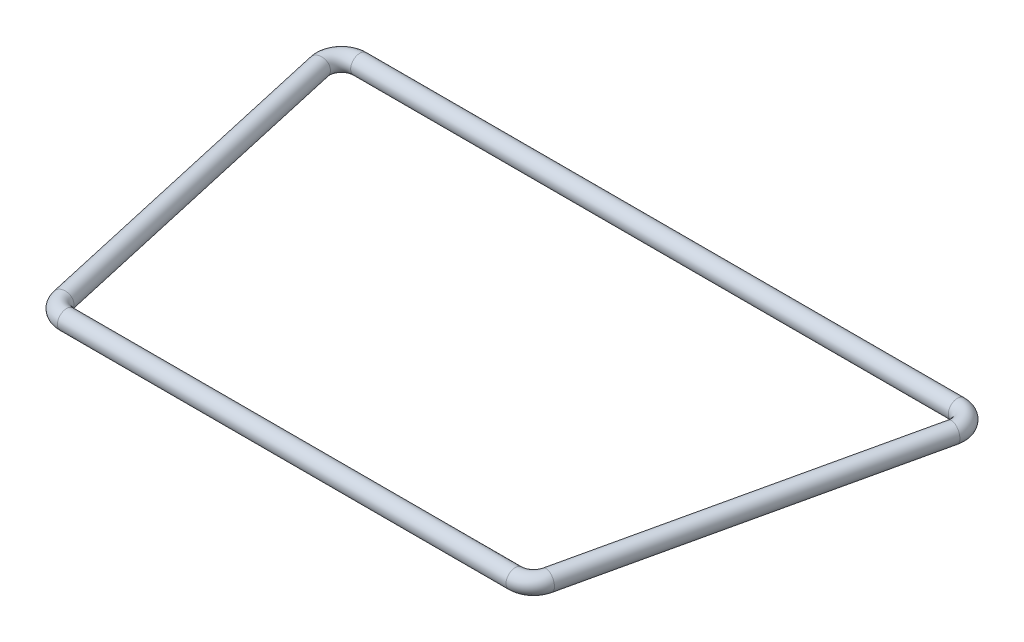
ISO-10303-21;
HEADER;
FILE_DESCRIPTION(('STEP AP214'),'2;1');
FILE_NAME('part.step','',(''),(''),'','','');
FILE_SCHEMA(('AUTOMOTIVE_DESIGN { 1 0 10303 214 1 1 1 1 }'));
ENDSEC;
DATA;
#1=APPLICATION_CONTEXT('core data for automotive mechanical design processes');
#2=APPLICATION_PROTOCOL_DEFINITION('international standard','automotive_design',2000,#1);
#3=PRODUCT_CONTEXT('',#1,'mechanical');
#4=PRODUCT('Part','Part','',(#3));
#5=PRODUCT_RELATED_PRODUCT_CATEGORY('part','',(#4));
#6=PRODUCT_DEFINITION_FORMATION('','',#4);
#7=PRODUCT_DEFINITION_CONTEXT('part definition',#1,'design');
#8=PRODUCT_DEFINITION('design','',#6,#7);
#9=PRODUCT_DEFINITION_SHAPE('','',#8);
#10=(LENGTH_UNIT() NAMED_UNIT(*) SI_UNIT(.MILLI.,.METRE.));
#11=(NAMED_UNIT(*) PLANE_ANGLE_UNIT() SI_UNIT($,.RADIAN.));
#12=(NAMED_UNIT(*) SI_UNIT($,.STERADIAN.) SOLID_ANGLE_UNIT());
#13=UNCERTAINTY_MEASURE_WITH_UNIT(LENGTH_MEASURE(1.E-05),#10,'distance_accuracy_value','');
#14=(GEOMETRIC_REPRESENTATION_CONTEXT(3) GLOBAL_UNCERTAINTY_ASSIGNED_CONTEXT((#13)) GLOBAL_UNIT_ASSIGNED_CONTEXT((#10,
#11,#12)) REPRESENTATION_CONTEXT('',''));
#15=CARTESIAN_POINT('',(0.,0.,0.));
#16=DIRECTION('',(0.,0.,1.));
#17=DIRECTION('',(1.,0.,0.));
#18=AXIS2_PLACEMENT_3D('',#15,#16,#17);
#19=CARTESIAN_POINT('',(30.988,0.,-2.53999999999999));
#20=DIRECTION('',(0.,1.,0.));
#21=DIRECTION('',(0.,0.,1.));
#22=AXIS2_PLACEMENT_3D('',#19,#20,#21);
#23=TOROIDAL_SURFACE('',#22,2.54,1.27);
#24=CARTESIAN_POINT('',(30.988,0.,0.));
#25=DIRECTION('',(1.,0.,0.));
#26=DIRECTION('',(0.,0.,-1.));
#27=AXIS2_PLACEMENT_3D('',#24,#25,#26);
#28=CIRCLE('',#27,1.27);
#29=CARTESIAN_POINT('',(30.988,0.,1.27000000000001));
#30=VERTEX_POINT('',#29);
#31=EDGE_CURVE('E11',#30,#30,#28,.T.);
#32=CARTESIAN_POINT('',(33.4660487804878,0.,-1.98243902439024));
#33=DIRECTION('',(0.21951219512195,0.,-0.975609756097561));
#34=DIRECTION('',(-0.975609756097561,0.,-0.21951219512195));
#35=AXIS2_PLACEMENT_3D('',#32,#33,#34);
#36=CIRCLE('',#35,1.27);
#37=CARTESIAN_POINT('',(34.7050731707317,0.,-1.70365853658536));
#38=VERTEX_POINT('',#37);
#39=EDGE_CURVE('E72',#38,#38,#36,.T.);
#40=CARTESIAN_POINT('',(30.988,0.,-2.53999999999999));
#41=DIRECTION('',(0.,1.,0.));
#42=DIRECTION('',(0.,0.,1.));
#43=AXIS2_PLACEMENT_3D('',#40,#41,#42);
#44=CIRCLE('',#43,3.81);
#45=EDGE_CURVE('',#30,#38,#44,.T.);
#46=ORIENTED_EDGE('',*,*,#31,.T.);
#47=ORIENTED_EDGE('',*,*,#39,.F.);
#48=ORIENTED_EDGE('',*,*,#45,.T.);
#49=ORIENTED_EDGE('',*,*,#45,.F.);
#50=EDGE_LOOP('',(#46,#48,#47,#49));
#51=FACE_BOUND('',#50,.T.);
#52=ADVANCED_FACE('F44',(#51),#23,.T.);
#53=CARTESIAN_POINT('',(-30.988,0.,0.));
#54=DIRECTION('',(1.,0.,0.));
#55=DIRECTION('',(0.,0.,-1.));
#56=AXIS2_PLACEMENT_3D('',#53,#54,#55);
#57=CYLINDRICAL_SURFACE('',#56,1.27);
#58=ORIENTED_EDGE('',*,*,#31,.F.);
#59=EDGE_LOOP('',(#58));
#60=FACE_BOUND('',#59,.T.);
#61=CARTESIAN_POINT('',(-30.988,0.,0.));
#62=DIRECTION('',(1.,0.,0.));
#63=DIRECTION('',(0.,0.,-1.));
#64=AXIS2_PLACEMENT_3D('',#61,#62,#63);
#65=CIRCLE('',#64,1.27);
#66=CARTESIAN_POINT('',(-30.988,0.,1.27));
#67=VERTEX_POINT('',#66);
#68=EDGE_CURVE('E50',#67,#67,#65,.T.);
#69=ORIENTED_EDGE('',*,*,#68,.T.);
#70=EDGE_LOOP('',(#69));
#71=FACE_BOUND('',#70,.T.);
#72=ADVANCED_FACE('F79',(#60,#71),#57,.T.);
#73=CARTESIAN_POINT('',(-30.988,0.,-2.53999999999999));
#74=DIRECTION('',(0.,1.,0.));
#75=DIRECTION('',(0.,0.,1.));
#76=AXIS2_PLACEMENT_3D('',#73,#74,#75);
#77=TOROIDAL_SURFACE('',#76,2.53999999999999,1.27);
#78=CARTESIAN_POINT('',(-33.4660487804878,0.,-1.98243902439024));
#79=DIRECTION('',(0.219512195121953,0.,0.975609756097561));
#80=DIRECTION('',(0.975609756097561,0.,-0.219512195121953));
#81=AXIS2_PLACEMENT_3D('',#78,#79,#80);
#82=CIRCLE('',#81,1.27);
#83=CARTESIAN_POINT('',(-34.7050731707317,0.,-1.70365853658535));
#84=VERTEX_POINT('',#83);
#85=EDGE_CURVE('E54',#84,#84,#82,.T.);
#86=CARTESIAN_POINT('',(-30.988,0.,-2.53999999999999));
#87=DIRECTION('',(0.,1.,0.));
#88=DIRECTION('',(0.,0.,1.));
#89=AXIS2_PLACEMENT_3D('',#86,#87,#88);
#90=CIRCLE('',#89,3.81);
#91=EDGE_CURVE('',#84,#67,#90,.T.);
#92=ORIENTED_EDGE('',*,*,#85,.T.);
#93=ORIENTED_EDGE('',*,*,#68,.F.);
#94=ORIENTED_EDGE('',*,*,#91,.T.);
#95=ORIENTED_EDGE('',*,*,#91,.F.);
#96=EDGE_LOOP('',(#92,#94,#93,#95));
#97=FACE_BOUND('',#96,.T.);
#98=ADVANCED_FACE('F83',(#97),#77,.T.);
#99=CARTESIAN_POINT('',(-43.7530487804878,0.,-47.7024390243902));
#100=DIRECTION('',(0.219512195121951,0.,0.975609756097561));
#101=DIRECTION('',(0.975609756097561,0.,-0.219512195121951));
#102=AXIS2_PLACEMENT_3D('',#99,#100,#101);
#103=CYLINDRICAL_SURFACE('',#102,1.27);
#104=ORIENTED_EDGE('',*,*,#85,.F.);
#105=EDGE_LOOP('',(#104));
#106=FACE_BOUND('',#105,.T.);
#107=CARTESIAN_POINT('',(-43.7530487804878,0.,-47.7024390243902));
#108=DIRECTION('',(0.219512195121953,0.,0.975609756097561));
#109=DIRECTION('',(0.975609756097561,0.,-0.219512195121953));
#110=AXIS2_PLACEMENT_3D('',#107,#108,#109);
#111=CIRCLE('',#110,1.27);
#112=CARTESIAN_POINT('',(-44.9920731707317,0.,-47.4236585365853));
#113=VERTEX_POINT('',#112);
#114=EDGE_CURVE('E58',#113,#113,#111,.T.);
#115=ORIENTED_EDGE('',*,*,#114,.T.);
#116=EDGE_LOOP('',(#115));
#117=FACE_BOUND('',#116,.T.);
#118=ADVANCED_FACE('F88',(#106,#117),#103,.T.);
#119=CARTESIAN_POINT('',(-41.275,0.,-48.26));
#120=DIRECTION('',(0.,1.,0.));
#121=DIRECTION('',(0.,0.,1.));
#122=AXIS2_PLACEMENT_3D('',#119,#120,#121);
#123=TOROIDAL_SURFACE('',#122,2.54,1.27);
#124=CARTESIAN_POINT('',(-41.275,0.,-50.8));
#125=DIRECTION('',(-1.,0.,0.));
#126=DIRECTION('',(0.,0.,1.));
#127=AXIS2_PLACEMENT_3D('',#124,#125,#126);
#128=CIRCLE('',#127,1.27);
#129=CARTESIAN_POINT('',(-41.275,0.,-52.07));
#130=VERTEX_POINT('',#129);
#131=EDGE_CURVE('E63',#130,#130,#128,.T.);
#132=CARTESIAN_POINT('',(-41.275,0.,-48.26));
#133=DIRECTION('',(0.,1.,0.));
#134=DIRECTION('',(0.,0.,1.));
#135=AXIS2_PLACEMENT_3D('',#132,#133,#134);
#136=CIRCLE('',#135,3.81);
#137=EDGE_CURVE('',#130,#113,#136,.T.);
#138=ORIENTED_EDGE('',*,*,#131,.T.);
#139=ORIENTED_EDGE('',*,*,#114,.F.);
#140=ORIENTED_EDGE('',*,*,#137,.T.);
#141=ORIENTED_EDGE('',*,*,#137,.F.);
#142=EDGE_LOOP('',(#138,#140,#139,#141));
#143=FACE_BOUND('',#142,.T.);
#144=ADVANCED_FACE('F94',(#143),#123,.T.);
#145=CARTESIAN_POINT('',(41.275,0.,-50.8));
#146=DIRECTION('',(-1.,0.,0.));
#147=DIRECTION('',(0.,0.,1.));
#148=AXIS2_PLACEMENT_3D('',#145,#146,#147);
#149=CYLINDRICAL_SURFACE('',#148,1.27);
#150=ORIENTED_EDGE('',*,*,#131,.F.);
#151=EDGE_LOOP('',(#150));
#152=FACE_BOUND('',#151,.T.);
#153=CARTESIAN_POINT('',(41.275,0.,-50.8));
#154=DIRECTION('',(-1.,0.,0.));
#155=DIRECTION('',(0.,0.,1.));
#156=AXIS2_PLACEMENT_3D('',#153,#154,#155);
#157=CIRCLE('',#156,1.27);
#158=CARTESIAN_POINT('',(41.275,0.,-52.07));
#159=VERTEX_POINT('',#158);
#160=EDGE_CURVE('E66',#159,#159,#157,.T.);
#161=ORIENTED_EDGE('',*,*,#160,.T.);
#162=EDGE_LOOP('',(#161));
#163=FACE_BOUND('',#162,.T.);
#164=ADVANCED_FACE('F98',(#152,#163),#149,.T.);
#165=CARTESIAN_POINT('',(41.275,0.,-48.26));
#166=DIRECTION('',(0.,1.,0.));
#167=DIRECTION('',(0.,0.,1.));
#168=AXIS2_PLACEMENT_3D('',#165,#166,#167);
#169=TOROIDAL_SURFACE('',#168,2.54,1.27);
#170=CARTESIAN_POINT('',(43.7530487804878,0.,-47.7024390243902));
#171=DIRECTION('',(0.21951219512195,0.,-0.975609756097561));
#172=DIRECTION('',(-0.975609756097561,0.,-0.21951219512195));
#173=AXIS2_PLACEMENT_3D('',#170,#171,#172);
#174=CIRCLE('',#173,1.27);
#175=CARTESIAN_POINT('',(44.9920731707317,0.,-47.4236585365853));
#176=VERTEX_POINT('',#175);
#177=EDGE_CURVE('E69',#176,#176,#174,.T.);
#178=CARTESIAN_POINT('',(41.275,0.,-48.26));
#179=DIRECTION('',(0.,1.,0.));
#180=DIRECTION('',(0.,0.,1.));
#181=AXIS2_PLACEMENT_3D('',#178,#179,#180);
#182=CIRCLE('',#181,3.81);
#183=EDGE_CURVE('',#176,#159,#182,.T.);
#184=ORIENTED_EDGE('',*,*,#177,.T.);
#185=ORIENTED_EDGE('',*,*,#160,.F.);
#186=ORIENTED_EDGE('',*,*,#183,.T.);
#187=ORIENTED_EDGE('',*,*,#183,.F.);
#188=EDGE_LOOP('',(#184,#186,#185,#187));
#189=FACE_BOUND('',#188,.T.);
#190=ADVANCED_FACE('F102',(#189),#169,.T.);
#191=CARTESIAN_POINT('',(33.4660487804878,0.,-1.98243902439024));
#192=DIRECTION('',(0.219512195121951,0.,-0.975609756097561));
#193=DIRECTION('',(-0.975609756097561,0.,-0.219512195121951));
#194=AXIS2_PLACEMENT_3D('',#191,#192,#193);
#195=CYLINDRICAL_SURFACE('',#194,1.27);
#196=ORIENTED_EDGE('',*,*,#177,.F.);
#197=EDGE_LOOP('',(#196));
#198=FACE_BOUND('',#197,.T.);
#199=ORIENTED_EDGE('',*,*,#39,.T.);
#200=EDGE_LOOP('',(#199));
#201=FACE_BOUND('',#200,.T.);
#202=ADVANCED_FACE('F76',(#198,#201),#195,.T.);
#203=CLOSED_SHELL('',(#52,#72,#98,#118,#144,#164,#190,#202));
#204=MANIFOLD_SOLID_BREP('B2',#203);
#205=ADVANCED_BREP_SHAPE_REPRESENTATION('',(#18,#204),#14);
#206=SHAPE_DEFINITION_REPRESENTATION(#9,#205);
ENDSEC;
END-ISO-10303-21;
